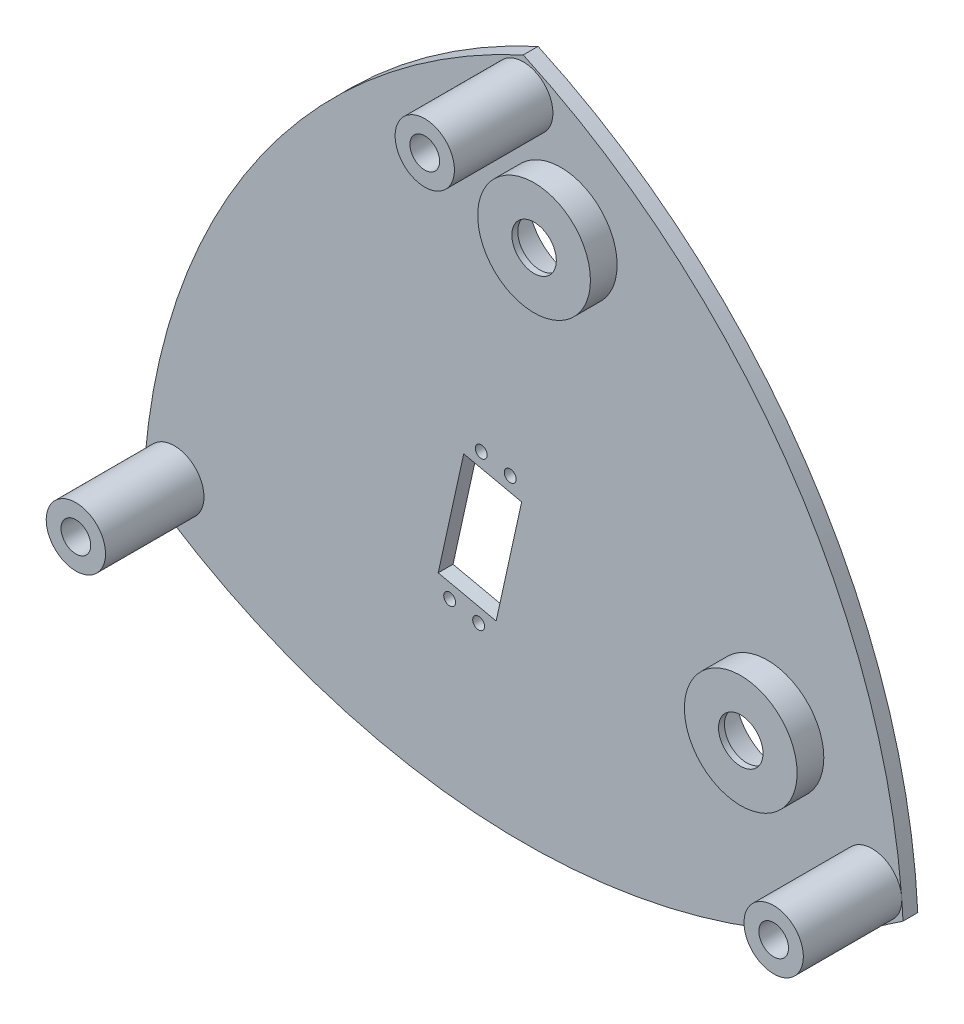
ISO-10303-21;
HEADER;
FILE_DESCRIPTION(('STEP AP214'),'2;1');
FILE_NAME('part.step','',(''),(''),'','','');
FILE_SCHEMA(('AUTOMOTIVE_DESIGN { 1 0 10303 214 1 1 1 1 }'));
ENDSEC;
DATA;
#1=APPLICATION_CONTEXT('core data for automotive mechanical design processes');
#2=APPLICATION_PROTOCOL_DEFINITION('international standard','automotive_design',2000,#1);
#3=PRODUCT_CONTEXT('',#1,'mechanical');
#4=PRODUCT('Part','Part','',(#3));
#5=PRODUCT_RELATED_PRODUCT_CATEGORY('part','',(#4));
#6=PRODUCT_DEFINITION_FORMATION('','',#4);
#7=PRODUCT_DEFINITION_CONTEXT('part definition',#1,'design');
#8=PRODUCT_DEFINITION('design','',#6,#7);
#9=PRODUCT_DEFINITION_SHAPE('','',#8);
#10=(LENGTH_UNIT() NAMED_UNIT(*) SI_UNIT(.MILLI.,.METRE.));
#11=(NAMED_UNIT(*) PLANE_ANGLE_UNIT() SI_UNIT($,.RADIAN.));
#12=(NAMED_UNIT(*) SI_UNIT($,.STERADIAN.) SOLID_ANGLE_UNIT());
#13=UNCERTAINTY_MEASURE_WITH_UNIT(LENGTH_MEASURE(1.E-05),#10,'distance_accuracy_value','');
#14=(GEOMETRIC_REPRESENTATION_CONTEXT(3) GLOBAL_UNCERTAINTY_ASSIGNED_CONTEXT((#13)) GLOBAL_UNIT_ASSIGNED_CONTEXT((#10,
#11,#12)) REPRESENTATION_CONTEXT('',''));
#15=CARTESIAN_POINT('',(0.,0.,0.));
#16=DIRECTION('',(0.,0.,1.));
#17=DIRECTION('',(1.,0.,0.));
#18=AXIS2_PLACEMENT_3D('',#15,#16,#17);
#19=CARTESIAN_POINT('',(-45.8494592180799,10.0108651432086,5.));
#20=DIRECTION('',(0.,0.,1.));
#21=DIRECTION('',(1.,0.,0.));
#22=AXIS2_PLACEMENT_3D('',#19,#20,#21);
#23=PLANE('',#22);
#24=CARTESIAN_POINT('',(-24.807535233517,-56.2577365393747,5.));
#25=DIRECTION('',(0.,0.,1.));
#26=DIRECTION('',(1.,0.,0.));
#27=AXIS2_PLACEMENT_3D('',#24,#25,#26);
#28=CIRCLE('',#27,2.00000000000001);
#29=CARTESIAN_POINT('',(-22.807535233517,-56.2577365393747,5.));
#30=VERTEX_POINT('',#29);
#31=EDGE_CURVE('E250',#30,#30,#28,.T.);
#32=ORIENTED_EDGE('',*,*,#31,.F.);
#33=EDGE_LOOP('',(#32));
#34=FACE_BOUND('',#33,.T.);
#35=CARTESIAN_POINT('',(-15.041579962368,-58.4085776869067,5.));
#36=DIRECTION('',(0.,0.,1.));
#37=DIRECTION('',(1.,0.,0.));
#38=AXIS2_PLACEMENT_3D('',#35,#36,#37);
#39=CIRCLE('',#38,2.);
#40=CARTESIAN_POINT('',(-13.041579962368,-58.4085776869067,5.));
#41=VERTEX_POINT('',#40);
#42=EDGE_CURVE('E266',#41,#41,#39,.T.);
#43=ORIENTED_EDGE('',*,*,#42,.F.);
#44=EDGE_LOOP('',(#43));
#45=FACE_BOUND('',#44,.T.);
#46=CARTESIAN_POINT('',(-14.1608715532334,-7.91625794718709,5.));
#47=DIRECTION('',(0.,0.,1.));
#48=DIRECTION('',(1.,0.,0.));
#49=AXIS2_PLACEMENT_3D('',#46,#47,#48);
#50=CIRCLE('',#49,2.);
#51=CARTESIAN_POINT('',(-12.1608715532334,-7.91625794718709,5.));
#52=VERTEX_POINT('',#51);
#53=EDGE_CURVE('E263',#52,#52,#50,.T.);
#54=ORIENTED_EDGE('',*,*,#53,.F.);
#55=EDGE_LOOP('',(#54));
#56=FACE_BOUND('',#55,.T.);
#57=CARTESIAN_POINT('',(-4.39491628208443,-10.0670990947191,5.));
#58=DIRECTION('',(0.,0.,1.));
#59=DIRECTION('',(1.,0.,0.));
#60=AXIS2_PLACEMENT_3D('',#57,#58,#59);
#61=CIRCLE('',#60,2.);
#62=CARTESIAN_POINT('',(-2.39491628208443,-10.0670990947191,5.));
#63=VERTEX_POINT('',#62);
#64=EDGE_CURVE('E260',#63,#63,#61,.T.);
#65=ORIENTED_EDGE('',*,*,#64,.F.);
#66=EDGE_LOOP('',(#65));
#67=FACE_BOUND('',#66,.T.);
#68=DIRECTION('',(-0.976595527114901,0.215084114753204,0.));
#69=VECTOR('',#68,1.);
#70=CARTESIAN_POINT('',(-49.1707529300035,-5.06956321395371,5.));
#71=LINE('',#70,#69);
#72=CARTESIAN_POINT('',(-0.53358819158764,-15.7813484222809,5.));
#73=VERTEX_POINT('',#72);
#74=CARTESIAN_POINT('',(-20.0654987338857,-11.4796661272169,5.));
#75=VERTEX_POINT('',#74);
#76=EDGE_CURVE('E141',#73,#75,#71,.T.);
#77=ORIENTED_EDGE('',*,*,#76,.F.);
#78=DIRECTION('',(0.215084114753204,0.976595527114901,0.));
#79=VECTOR('',#78,1.);
#80=CARTESIAN_POINT('',(2.78770552033589,-0.700920065118668,5.));
#81=LINE('',#80,#79);
#82=CARTESIAN_POINT('',(-9.13695278171582,-54.845169506877,5.));
#83=VERTEX_POINT('',#82);
#84=EDGE_CURVE('E134',#83,#73,#81,.T.);
#85=ORIENTED_EDGE('',*,*,#84,.F.);
#86=DIRECTION('',(0.976595527114901,-0.215084114753204,0.));
#87=VECTOR('',#86,1.);
#88=CARTESIAN_POINT('',(-57.7741175201316,-44.1333842985497,5.));
#89=LINE('',#88,#87);
#90=CARTESIAN_POINT('',(-28.6688633240138,-50.5434872118129,5.));
#91=VERTEX_POINT('',#90);
#92=EDGE_CURVE('E114',#91,#83,#89,.T.);
#93=ORIENTED_EDGE('',*,*,#92,.F.);
#94=DIRECTION('',(-0.215084114753204,-0.976595527114901,0.));
#95=VECTOR('',#94,1.);
#96=CARTESIAN_POINT('',(-16.7442050219621,3.60076222994541,5.));
#97=LINE('',#96,#95);
#98=EDGE_CURVE('E139',#75,#91,#97,.T.);
#99=ORIENTED_EDGE('',*,*,#98,.F.);
#100=EDGE_LOOP('',(#77,#85,#93,#99));
#101=FACE_BOUND('',#100,.T.);
#102=CARTESIAN_POINT('',(82.3341256154464,-39.5307187827287,5.));
#103=DIRECTION('',(0.,0.,1.));
#104=DIRECTION('',(1.,0.,0.));
#105=AXIS2_PLACEMENT_3D('',#102,#103,#104);
#106=CIRCLE('',#105,19.);
#107=CARTESIAN_POINT('',(101.334125615446,-39.5307187827287,5.));
#108=VERTEX_POINT('',#107);
#109=EDGE_CURVE('E168',#108,#108,#106,.T.);
#110=ORIENTED_EDGE('',*,*,#109,.F.);
#111=EDGE_LOOP('',(#110));
#112=FACE_BOUND('',#111,.T.);
#113=CARTESIAN_POINT('',(0.,103.,5.));
#114=DIRECTION('',(0.,0.,1.));
#115=DIRECTION('',(1.,0.,0.));
#116=AXIS2_PLACEMENT_3D('',#113,#114,#115);
#117=CIRCLE('',#116,10.);
#118=CARTESIAN_POINT('',(-10.,103.,5.));
#119=VERTEX_POINT('',#118);
#120=EDGE_CURVE('E208',#119,#119,#117,.T.);
#121=ORIENTED_EDGE('',*,*,#120,.F.);
#122=EDGE_LOOP('',(#121));
#123=FACE_BOUND('',#122,.T.);
#124=CARTESIAN_POINT('',(-91.6989184361599,-84.9782697135829,5.));
#125=DIRECTION('',(0.,0.,1.));
#126=DIRECTION('',(1.,0.,0.));
#127=AXIS2_PLACEMENT_3D('',#124,#125,#126);
#128=CIRCLE('',#127,220.);
#129=CARTESIAN_POINT('',(128.022678921713,-73.9139281378286,5.));
#130=VERTEX_POINT('',#129);
#131=CARTESIAN_POINT('',(127.62978060665,-67.804983010433,5.));
#132=VERTEX_POINT('',#131);
#133=EDGE_CURVE('E229',#130,#132,#128,.T.);
#134=ORIENTED_EDGE('',*,*,#133,.T.);
#135=CARTESIAN_POINT('',(117.630374076299,-67.9139281378286,5.));
#136=DIRECTION('',(0.,0.,1.));
#137=DIRECTION('',(1.,0.,0.));
#138=AXIS2_PLACEMENT_3D('',#135,#136,#137);
#139=CIRCLE('',#138,9.99999999999999);
#140=CARTESIAN_POINT('',(127.515403429057,-66.4019113736612,5.));
#141=VERTEX_POINT('',#140);
#142=EDGE_CURVE('E182',#141,#132,#139,.T.);
#143=ORIENTED_EDGE('',*,*,#142,.F.);
#144=CARTESIAN_POINT('',(0.,115.,5.));
#145=VERTEX_POINT('',#144);
#146=EDGE_CURVE('E227',#141,#145,#128,.T.);
#147=ORIENTED_EDGE('',*,*,#146,.T.);
#148=CARTESIAN_POINT('',(91.6989184361599,-84.9782697135829,5.));
#149=DIRECTION('',(0.,0.,1.));
#150=DIRECTION('',(-1.,0.,0.));
#151=AXIS2_PLACEMENT_3D('',#148,#149,#150);
#152=CIRCLE('',#151,220.);
#153=CARTESIAN_POINT('',(-127.515403429057,-66.4019113736612,5.));
#154=VERTEX_POINT('',#153);
#155=EDGE_CURVE('E233',#145,#154,#152,.T.);
#156=ORIENTED_EDGE('',*,*,#155,.T.);
#157=CARTESIAN_POINT('',(-117.630374076299,-67.9139281378286,5.));
#158=DIRECTION('',(0.,0.,1.));
#159=DIRECTION('',(1.,0.,0.));
#160=AXIS2_PLACEMENT_3D('',#157,#158,#159);
#161=CIRCLE('',#160,9.99999999999999);
#162=CARTESIAN_POINT('',(-127.62978060665,-67.804983010433,5.));
#163=VERTEX_POINT('',#162);
#164=EDGE_CURVE('E195',#163,#154,#161,.T.);
#165=ORIENTED_EDGE('',*,*,#164,.F.);
#166=CARTESIAN_POINT('',(-128.022678921713,-73.9139281378286,5.));
#167=VERTEX_POINT('',#166);
#168=EDGE_CURVE('E232',#163,#167,#152,.T.);
#169=ORIENTED_EDGE('',*,*,#168,.T.);
#170=CARTESIAN_POINT('',(0.,105.,5.));
#171=DIRECTION('',(0.,0.,1.));
#172=DIRECTION('',(1.,0.,0.));
#173=AXIS2_PLACEMENT_3D('',#170,#171,#172);
#174=CIRCLE('',#173,220.);
#175=EDGE_CURVE('E224',#167,#130,#174,.T.);
#176=ORIENTED_EDGE('',*,*,#175,.T.);
#177=EDGE_LOOP('',(#134,#143,#147,#156,#165,#169,#176));
#178=FACE_BOUND('',#177,.T.);
#179=CARTESIAN_POINT('',(12.6509950664097,69.5155367413891,5.));
#180=DIRECTION('',(0.,0.,1.));
#181=DIRECTION('',(1.,0.,0.));
#182=AXIS2_PLACEMENT_3D('',#179,#180,#181);
#183=CIRCLE('',#182,19.);
#184=CARTESIAN_POINT('',(31.6509950664097,69.5155367413891,5.));
#185=VERTEX_POINT('',#184);
#186=EDGE_CURVE('E165',#185,#185,#183,.T.);
#187=ORIENTED_EDGE('',*,*,#186,.F.);
#188=EDGE_LOOP('',(#187));
#189=FACE_BOUND('',#188,.T.);
#190=ADVANCED_FACE('F35',(#34,#45,#56,#67,#101,#112,#123,#178,#189),#23,.T.);
#191=CARTESIAN_POINT('',(-45.8494592180799,10.0108651432086,0.));
#192=DIRECTION('',(0.,0.,1.));
#193=DIRECTION('',(1.,0.,0.));
#194=AXIS2_PLACEMENT_3D('',#191,#192,#193);
#195=PLANE('',#194);
#196=CARTESIAN_POINT('',(-24.807535233517,-56.2577365393747,0.));
#197=DIRECTION('',(0.,0.,1.));
#198=DIRECTION('',(1.,0.,0.));
#199=AXIS2_PLACEMENT_3D('',#196,#197,#198);
#200=CIRCLE('',#199,2.00000000000001);
#201=CARTESIAN_POINT('',(-22.807535233517,-56.2577365393747,0.));
#202=VERTEX_POINT('',#201);
#203=EDGE_CURVE('E39',#202,#202,#200,.T.);
#204=ORIENTED_EDGE('',*,*,#203,.T.);
#205=EDGE_LOOP('',(#204));
#206=FACE_BOUND('',#205,.T.);
#207=CARTESIAN_POINT('',(-15.041579962368,-58.4085776869067,0.));
#208=DIRECTION('',(0.,0.,1.));
#209=DIRECTION('',(1.,0.,0.));
#210=AXIS2_PLACEMENT_3D('',#207,#208,#209);
#211=CIRCLE('',#210,2.);
#212=CARTESIAN_POINT('',(-13.041579962368,-58.4085776869067,0.));
#213=VERTEX_POINT('',#212);
#214=EDGE_CURVE('E252',#213,#213,#211,.T.);
#215=ORIENTED_EDGE('',*,*,#214,.T.);
#216=EDGE_LOOP('',(#215));
#217=FACE_BOUND('',#216,.T.);
#218=CARTESIAN_POINT('',(-14.1608715532334,-7.91625794718709,0.));
#219=DIRECTION('',(0.,0.,1.));
#220=DIRECTION('',(1.,0.,0.));
#221=AXIS2_PLACEMENT_3D('',#218,#219,#220);
#222=CIRCLE('',#221,2.);
#223=CARTESIAN_POINT('',(-12.1608715532334,-7.91625794718709,0.));
#224=VERTEX_POINT('',#223);
#225=EDGE_CURVE('E249',#224,#224,#222,.T.);
#226=ORIENTED_EDGE('',*,*,#225,.T.);
#227=EDGE_LOOP('',(#226));
#228=FACE_BOUND('',#227,.T.);
#229=CARTESIAN_POINT('',(-4.39491628208443,-10.0670990947191,0.));
#230=DIRECTION('',(0.,0.,1.));
#231=DIRECTION('',(1.,0.,0.));
#232=AXIS2_PLACEMENT_3D('',#229,#230,#231);
#233=CIRCLE('',#232,2.);
#234=CARTESIAN_POINT('',(-2.39491628208443,-10.0670990947191,0.));
#235=VERTEX_POINT('',#234);
#236=EDGE_CURVE('E246',#235,#235,#233,.T.);
#237=ORIENTED_EDGE('',*,*,#236,.T.);
#238=EDGE_LOOP('',(#237));
#239=FACE_BOUND('',#238,.T.);
#240=DIRECTION('',(-0.215084114753204,-0.976595527114901,0.));
#241=VECTOR('',#240,1.);
#242=CARTESIAN_POINT('',(-9.13695278171581,-54.845169506877,0.));
#243=LINE('',#242,#241);
#244=CARTESIAN_POINT('',(-0.533588191587647,-15.7813484222809,0.));
#245=VERTEX_POINT('',#244);
#246=CARTESIAN_POINT('',(-9.13695278171581,-54.845169506877,0.));
#247=VERTEX_POINT('',#246);
#248=EDGE_CURVE('E120',#245,#247,#243,.T.);
#249=ORIENTED_EDGE('',*,*,#248,.F.);
#250=DIRECTION('',(0.976595527114901,-0.215084114753204,0.));
#251=VECTOR('',#250,1.);
#252=CARTESIAN_POINT('',(-0.53358819158764,-15.7813484222809,0.));
#253=LINE('',#252,#251);
#254=CARTESIAN_POINT('',(-20.0654987338857,-11.4796661272169,0.));
#255=VERTEX_POINT('',#254);
#256=EDGE_CURVE('E60',#255,#245,#253,.T.);
#257=ORIENTED_EDGE('',*,*,#256,.F.);
#258=DIRECTION('',(0.215084114753204,0.976595527114901,0.));
#259=VECTOR('',#258,1.);
#260=CARTESIAN_POINT('',(-20.0654987338857,-11.4796661272169,0.));
#261=LINE('',#260,#259);
#262=CARTESIAN_POINT('',(-28.6688633240138,-50.5434872118129,0.));
#263=VERTEX_POINT('',#262);
#264=EDGE_CURVE('E127',#263,#255,#261,.T.);
#265=ORIENTED_EDGE('',*,*,#264,.F.);
#266=DIRECTION('',(-0.976595527114901,0.215084114753204,0.));
#267=VECTOR('',#266,1.);
#268=CARTESIAN_POINT('',(-28.6688633240138,-50.5434872118129,0.));
#269=LINE('',#268,#267);
#270=EDGE_CURVE('E111',#247,#263,#269,.T.);
#271=ORIENTED_EDGE('',*,*,#270,.F.);
#272=EDGE_LOOP('',(#249,#257,#265,#271));
#273=FACE_BOUND('',#272,.T.);
#274=CARTESIAN_POINT('',(12.6509950664097,69.5155367413891,0.));
#275=DIRECTION('',(0.,0.,-1.));
#276=DIRECTION('',(-1.,0.,0.));
#277=AXIS2_PLACEMENT_3D('',#274,#275,#276);
#278=CIRCLE('',#277,16.);
#279=CARTESIAN_POINT('',(-3.34900493359029,69.5155367413891,0.));
#280=VERTEX_POINT('',#279);
#281=EDGE_CURVE('E174',#280,#280,#278,.T.);
#282=ORIENTED_EDGE('',*,*,#281,.F.);
#283=EDGE_LOOP('',(#282));
#284=FACE_BOUND('',#283,.T.);
#285=CARTESIAN_POINT('',(82.3341256154464,-39.5307187827287,0.));
#286=DIRECTION('',(0.,0.,-1.));
#287=DIRECTION('',(-1.,0.,0.));
#288=AXIS2_PLACEMENT_3D('',#285,#286,#287);
#289=CIRCLE('',#288,16.);
#290=CARTESIAN_POINT('',(66.3341256154464,-39.5307187827287,0.));
#291=VERTEX_POINT('',#290);
#292=EDGE_CURVE('E173',#291,#291,#289,.T.);
#293=ORIENTED_EDGE('',*,*,#292,.F.);
#294=EDGE_LOOP('',(#293));
#295=FACE_BOUND('',#294,.T.);
#296=CARTESIAN_POINT('',(0.,105.,0.));
#297=DIRECTION('',(0.,0.,1.));
#298=DIRECTION('',(1.,0.,0.));
#299=AXIS2_PLACEMENT_3D('',#296,#297,#298);
#300=CIRCLE('',#299,220.);
#301=CARTESIAN_POINT('',(-128.022678921713,-73.9139281378286,0.));
#302=VERTEX_POINT('',#301);
#303=CARTESIAN_POINT('',(128.022678921713,-73.9139281378286,0.));
#304=VERTEX_POINT('',#303);
#305=EDGE_CURVE('E223',#302,#304,#300,.T.);
#306=ORIENTED_EDGE('',*,*,#305,.F.);
#307=CARTESIAN_POINT('',(91.6989184361599,-84.9782697135829,0.));
#308=DIRECTION('',(0.,0.,1.));
#309=DIRECTION('',(-1.,0.,0.));
#310=AXIS2_PLACEMENT_3D('',#307,#308,#309);
#311=CIRCLE('',#310,220.);
#312=CARTESIAN_POINT('',(0.,115.,0.));
#313=VERTEX_POINT('',#312);
#314=EDGE_CURVE('E228',#313,#302,#311,.T.);
#315=ORIENTED_EDGE('',*,*,#314,.F.);
#316=CARTESIAN_POINT('',(-91.6989184361599,-84.9782697135829,0.));
#317=DIRECTION('',(0.,0.,1.));
#318=DIRECTION('',(1.,0.,0.));
#319=AXIS2_PLACEMENT_3D('',#316,#317,#318);
#320=CIRCLE('',#319,220.);
#321=EDGE_CURVE('E239',#304,#313,#320,.T.);
#322=ORIENTED_EDGE('',*,*,#321,.F.);
#323=EDGE_LOOP('',(#306,#315,#322));
#324=FACE_BOUND('',#323,.T.);
#325=CARTESIAN_POINT('',(-117.630374076299,-67.9139281378286,0.));
#326=DIRECTION('',(0.,0.,1.));
#327=DIRECTION('',(1.,0.,0.));
#328=AXIS2_PLACEMENT_3D('',#325,#326,#327);
#329=CIRCLE('',#328,5.00000000000001);
#330=CARTESIAN_POINT('',(-112.630374076299,-67.9139281378286,0.));
#331=VERTEX_POINT('',#330);
#332=EDGE_CURVE('E220',#331,#331,#329,.T.);
#333=ORIENTED_EDGE('',*,*,#332,.T.);
#334=EDGE_LOOP('',(#333));
#335=FACE_BOUND('',#334,.T.);
#336=CARTESIAN_POINT('',(117.630374076299,-67.9139281378286,0.));
#337=DIRECTION('',(0.,0.,1.));
#338=DIRECTION('',(1.,0.,0.));
#339=AXIS2_PLACEMENT_3D('',#336,#337,#338);
#340=CIRCLE('',#339,5.00000000000001);
#341=CARTESIAN_POINT('',(122.630374076299,-67.9139281378286,0.));
#342=VERTEX_POINT('',#341);
#343=EDGE_CURVE('E217',#342,#342,#340,.T.);
#344=ORIENTED_EDGE('',*,*,#343,.T.);
#345=EDGE_LOOP('',(#344));
#346=FACE_BOUND('',#345,.T.);
#347=CARTESIAN_POINT('',(0.,103.,0.));
#348=DIRECTION('',(0.,0.,1.));
#349=DIRECTION('',(1.,0.,0.));
#350=AXIS2_PLACEMENT_3D('',#347,#348,#349);
#351=CIRCLE('',#350,5.);
#352=CARTESIAN_POINT('',(5.,103.,0.));
#353=VERTEX_POINT('',#352);
#354=EDGE_CURVE('E212',#353,#353,#351,.T.);
#355=ORIENTED_EDGE('',*,*,#354,.T.);
#356=EDGE_LOOP('',(#355));
#357=FACE_BOUND('',#356,.T.);
#358=ADVANCED_FACE('F124',(#206,#217,#228,#239,#273,#284,#295,#324,#335,#346,#357),#195,.F.);
#359=CARTESIAN_POINT('',(0.,105.,5.));
#360=DIRECTION('',(0.,0.,-1.));
#361=DIRECTION('',(-1.,0.,0.));
#362=AXIS2_PLACEMENT_3D('',#359,#360,#361);
#363=CYLINDRICAL_SURFACE('',#362,220.);
#364=ORIENTED_EDGE('',*,*,#305,.T.);
#365=DIRECTION('',(0.,0.,-1.));
#366=VECTOR('',#365,1.);
#367=CARTESIAN_POINT('',(128.022678921713,-73.9139281378286,5.));
#368=LINE('',#367,#366);
#369=EDGE_CURVE('E11',#130,#304,#368,.T.);
#370=ORIENTED_EDGE('',*,*,#369,.F.);
#371=ORIENTED_EDGE('',*,*,#175,.F.);
#372=DIRECTION('',(0.,0.,-1.));
#373=VECTOR('',#372,1.);
#374=CARTESIAN_POINT('',(-128.022678921713,-73.9139281378286,5.));
#375=LINE('',#374,#373);
#376=EDGE_CURVE('E236',#167,#302,#375,.T.);
#377=ORIENTED_EDGE('',*,*,#376,.T.);
#378=EDGE_LOOP('',(#364,#370,#371,#377));
#379=FACE_BOUND('',#378,.T.);
#380=ADVANCED_FACE('F37',(#379),#363,.T.);
#381=CARTESIAN_POINT('',(-91.6989184361599,-84.9782697135829,5.));
#382=DIRECTION('',(0.,0.,-1.));
#383=DIRECTION('',(-1.,0.,0.));
#384=AXIS2_PLACEMENT_3D('',#381,#382,#383);
#385=CYLINDRICAL_SURFACE('',#384,220.);
#386=ORIENTED_EDGE('',*,*,#321,.T.);
#387=DIRECTION('',(0.,0.,-1.));
#388=VECTOR('',#387,1.);
#389=CARTESIAN_POINT('',(0.,115.,5.));
#390=LINE('',#389,#388);
#391=EDGE_CURVE('E44',#145,#313,#390,.T.);
#392=ORIENTED_EDGE('',*,*,#391,.F.);
#393=ORIENTED_EDGE('',*,*,#146,.F.);
#394=CARTESIAN_POINT('',(-91.6989184361599,-84.9782697135829,5.));
#395=DIRECTION('',(0.,0.,1.));
#396=DIRECTION('',(1.,0.,0.));
#397=AXIS2_PLACEMENT_3D('',#394,#395,#396);
#398=CIRCLE('',#397,220.);
#399=EDGE_CURVE('E186',#132,#141,#398,.T.);
#400=ORIENTED_EDGE('',*,*,#399,.F.);
#401=ORIENTED_EDGE('',*,*,#133,.F.);
#402=ORIENTED_EDGE('',*,*,#369,.T.);
#403=EDGE_LOOP('',(#386,#392,#393,#400,#401,#402));
#404=FACE_BOUND('',#403,.T.);
#405=ADVANCED_FACE('F384',(#404),#385,.T.);
#406=CARTESIAN_POINT('',(91.6989184361599,-84.9782697135829,5.));
#407=DIRECTION('',(0.,0.,-1.));
#408=DIRECTION('',(-1.,0.,0.));
#409=AXIS2_PLACEMENT_3D('',#406,#407,#408);
#410=CYLINDRICAL_SURFACE('',#409,220.);
#411=ORIENTED_EDGE('',*,*,#314,.T.);
#412=ORIENTED_EDGE('',*,*,#376,.F.);
#413=ORIENTED_EDGE('',*,*,#168,.F.);
#414=CARTESIAN_POINT('',(91.6989184361599,-84.9782697135829,5.));
#415=DIRECTION('',(0.,0.,1.));
#416=DIRECTION('',(1.,0.,0.));
#417=AXIS2_PLACEMENT_3D('',#414,#415,#416);
#418=CIRCLE('',#417,220.);
#419=EDGE_CURVE('E199',#154,#163,#418,.T.);
#420=ORIENTED_EDGE('',*,*,#419,.F.);
#421=ORIENTED_EDGE('',*,*,#155,.F.);
#422=ORIENTED_EDGE('',*,*,#391,.T.);
#423=EDGE_LOOP('',(#411,#412,#413,#420,#421,#422));
#424=FACE_BOUND('',#423,.T.);
#425=ADVANCED_FACE('F378',(#424),#410,.T.);
#426=CARTESIAN_POINT('',(-117.630374076299,-67.9139281378286,5.));
#427=DIRECTION('',(0.,0.,-1.));
#428=DIRECTION('',(-1.,0.,0.));
#429=AXIS2_PLACEMENT_3D('',#426,#427,#428);
#430=CYLINDRICAL_SURFACE('',#429,5.00000000000001);
#431=ORIENTED_EDGE('',*,*,#332,.F.);
#432=EDGE_LOOP('',(#431));
#433=FACE_BOUND('',#432,.T.);
#434=CARTESIAN_POINT('',(-117.630374076299,-67.9139281378286,38.2));
#435=DIRECTION('',(0.,0.,1.));
#436=DIRECTION('',(1.,0.,0.));
#437=AXIS2_PLACEMENT_3D('',#434,#435,#436);
#438=CIRCLE('',#437,5.00000000000001);
#439=CARTESIAN_POINT('',(-112.630374076299,-67.9139281378286,38.2));
#440=VERTEX_POINT('',#439);
#441=EDGE_CURVE('E192',#440,#440,#438,.T.);
#442=ORIENTED_EDGE('',*,*,#441,.T.);
#443=EDGE_LOOP('',(#442));
#444=FACE_BOUND('',#443,.T.);
#445=ADVANCED_FACE('F375',(#433,#444),#430,.F.);
#446=CARTESIAN_POINT('',(117.630374076299,-67.9139281378286,5.));
#447=DIRECTION('',(0.,0.,-1.));
#448=DIRECTION('',(-1.,0.,0.));
#449=AXIS2_PLACEMENT_3D('',#446,#447,#448);
#450=CYLINDRICAL_SURFACE('',#449,5.00000000000001);
#451=ORIENTED_EDGE('',*,*,#343,.F.);
#452=EDGE_LOOP('',(#451));
#453=FACE_BOUND('',#452,.T.);
#454=CARTESIAN_POINT('',(117.630374076299,-67.9139281378286,38.2));
#455=DIRECTION('',(0.,0.,1.));
#456=DIRECTION('',(1.,0.,0.));
#457=AXIS2_PLACEMENT_3D('',#454,#455,#456);
#458=CIRCLE('',#457,5.00000000000001);
#459=CARTESIAN_POINT('',(122.630374076299,-67.9139281378286,38.2));
#460=VERTEX_POINT('',#459);
#461=EDGE_CURVE('E177',#460,#460,#458,.T.);
#462=ORIENTED_EDGE('',*,*,#461,.T.);
#463=EDGE_LOOP('',(#462));
#464=FACE_BOUND('',#463,.T.);
#465=ADVANCED_FACE('F371',(#453,#464),#450,.F.);
#466=CARTESIAN_POINT('',(0.,103.,5.));
#467=DIRECTION('',(0.,0.,-1.));
#468=DIRECTION('',(-1.,0.,0.));
#469=AXIS2_PLACEMENT_3D('',#466,#467,#468);
#470=CYLINDRICAL_SURFACE('',#469,5.);
#471=ORIENTED_EDGE('',*,*,#354,.F.);
#472=EDGE_LOOP('',(#471));
#473=FACE_BOUND('',#472,.T.);
#474=CARTESIAN_POINT('',(0.,103.,38.2));
#475=DIRECTION('',(0.,0.,1.));
#476=DIRECTION('',(1.,0.,0.));
#477=AXIS2_PLACEMENT_3D('',#474,#475,#476);
#478=CIRCLE('',#477,5.);
#479=CARTESIAN_POINT('',(5.,103.,38.2));
#480=VERTEX_POINT('',#479);
#481=EDGE_CURVE('E205',#480,#480,#478,.T.);
#482=ORIENTED_EDGE('',*,*,#481,.T.);
#483=EDGE_LOOP('',(#482));
#484=FACE_BOUND('',#483,.T.);
#485=ADVANCED_FACE('F364',(#473,#484),#470,.F.);
#486=CARTESIAN_POINT('',(0.,103.,38.2));
#487=DIRECTION('',(0.,0.,1.));
#488=DIRECTION('',(1.,0.,0.));
#489=AXIS2_PLACEMENT_3D('',#486,#487,#488);
#490=PLANE('',#489);
#491=CARTESIAN_POINT('',(0.,103.,38.2));
#492=DIRECTION('',(0.,0.,1.));
#493=DIRECTION('',(1.,0.,0.));
#494=AXIS2_PLACEMENT_3D('',#491,#492,#493);
#495=CIRCLE('',#494,10.);
#496=CARTESIAN_POINT('',(-10.,103.,38.2));
#497=VERTEX_POINT('',#496);
#498=EDGE_CURVE('E209',#497,#497,#495,.T.);
#499=ORIENTED_EDGE('',*,*,#498,.T.);
#500=EDGE_LOOP('',(#499));
#501=FACE_BOUND('',#500,.T.);
#502=ORIENTED_EDGE('',*,*,#481,.F.);
#503=EDGE_LOOP('',(#502));
#504=FACE_BOUND('',#503,.T.);
#505=ADVANCED_FACE('F361',(#501,#504),#490,.T.);
#506=CARTESIAN_POINT('',(0.,103.,38.2));
#507=DIRECTION('',(0.,0.,-1.));
#508=DIRECTION('',(-1.,0.,0.));
#509=AXIS2_PLACEMENT_3D('',#506,#507,#508);
#510=CYLINDRICAL_SURFACE('',#509,10.);
#511=CARTESIAN_POINT('',(-10.,103.,38.2));
#512=CARTESIAN_POINT('',(-10.,103.,37.8541666666667));
#513=CARTESIAN_POINT('',(-10.,103.,37.5083333333333));
#514=CARTESIAN_POINT('',(-10.,103.,36.8166666666667));
#515=CARTESIAN_POINT('',(-10.,103.,36.4708333333333));
#516=CARTESIAN_POINT('',(-10.,103.,35.7791666666667));
#517=CARTESIAN_POINT('',(-10.,103.,35.4333333333333));
#518=CARTESIAN_POINT('',(-10.,103.,34.7416666666667));
#519=CARTESIAN_POINT('',(-10.,103.,34.3958333333333));
#520=CARTESIAN_POINT('',(-10.,103.,33.7041666666667));
#521=CARTESIAN_POINT('',(-10.,103.,33.3583333333333));
#522=CARTESIAN_POINT('',(-10.,103.,32.6666666666667));
#523=CARTESIAN_POINT('',(-10.,103.,32.3208333333333));
#524=CARTESIAN_POINT('',(-10.,103.,31.6291666666667));
#525=CARTESIAN_POINT('',(-10.,103.,31.2833333333333));
#526=CARTESIAN_POINT('',(-10.,103.,30.5916666666667));
#527=CARTESIAN_POINT('',(-10.,103.,30.2458333333333));
#528=CARTESIAN_POINT('',(-10.,103.,29.5541666666667));
#529=CARTESIAN_POINT('',(-10.,103.,29.2083333333333));
#530=CARTESIAN_POINT('',(-10.,103.,28.5166666666667));
#531=CARTESIAN_POINT('',(-10.,103.,28.1708333333333));
#532=CARTESIAN_POINT('',(-10.,103.,27.4791666666667));
#533=CARTESIAN_POINT('',(-10.,103.,27.1333333333333));
#534=CARTESIAN_POINT('',(-10.,103.,26.4416666666667));
#535=CARTESIAN_POINT('',(-10.,103.,26.0958333333333));
#536=CARTESIAN_POINT('',(-10.,103.,25.4041666666667));
#537=CARTESIAN_POINT('',(-10.,103.,25.0583333333333));
#538=CARTESIAN_POINT('',(-10.,103.,24.3666666666667));
#539=CARTESIAN_POINT('',(-10.,103.,24.0208333333333));
#540=CARTESIAN_POINT('',(-10.,103.,23.3291666666667));
#541=CARTESIAN_POINT('',(-10.,103.,22.9833333333333));
#542=CARTESIAN_POINT('',(-10.,103.,22.2916666666667));
#543=CARTESIAN_POINT('',(-10.,103.,21.9458333333333));
#544=CARTESIAN_POINT('',(-10.,103.,21.2541666666667));
#545=CARTESIAN_POINT('',(-10.,103.,20.9083333333333));
#546=CARTESIAN_POINT('',(-10.,103.,20.2166666666667));
#547=CARTESIAN_POINT('',(-10.,103.,19.8708333333333));
#548=CARTESIAN_POINT('',(-10.,103.,19.1791666666667));
#549=CARTESIAN_POINT('',(-10.,103.,18.8333333333333));
#550=CARTESIAN_POINT('',(-10.,103.,18.1416666666667));
#551=CARTESIAN_POINT('',(-10.,103.,17.7958333333333));
#552=CARTESIAN_POINT('',(-10.,103.,17.1041666666667));
#553=CARTESIAN_POINT('',(-10.,103.,16.7583333333333));
#554=CARTESIAN_POINT('',(-10.,103.,16.0666666666667));
#555=CARTESIAN_POINT('',(-10.,103.,15.7208333333333));
#556=CARTESIAN_POINT('',(-10.,103.,15.0291666666667));
#557=CARTESIAN_POINT('',(-10.,103.,14.6833333333333));
#558=CARTESIAN_POINT('',(-10.,103.,13.9916666666667));
#559=CARTESIAN_POINT('',(-10.,103.,13.6458333333333));
#560=CARTESIAN_POINT('',(-10.,103.,12.9541666666667));
#561=CARTESIAN_POINT('',(-10.,103.,12.6083333333333));
#562=CARTESIAN_POINT('',(-10.,103.,11.9166666666667));
#563=CARTESIAN_POINT('',(-10.,103.,11.5708333333333));
#564=CARTESIAN_POINT('',(-10.,103.,10.8791666666667));
#565=CARTESIAN_POINT('',(-10.,103.,10.5333333333333));
#566=CARTESIAN_POINT('',(-10.,103.,9.84166666666667));
#567=CARTESIAN_POINT('',(-10.,103.,9.49583333333333));
#568=CARTESIAN_POINT('',(-10.,103.,8.80416666666667));
#569=CARTESIAN_POINT('',(-10.,103.,8.45833333333333));
#570=CARTESIAN_POINT('',(-10.,103.,7.76666666666666));
#571=CARTESIAN_POINT('',(-10.,103.,7.42083333333333));
#572=CARTESIAN_POINT('',(-10.,103.,6.72916666666666));
#573=CARTESIAN_POINT('',(-10.,103.,6.38333333333333));
#574=CARTESIAN_POINT('',(-10.,103.,5.69166666666666));
#575=CARTESIAN_POINT('',(-10.,103.,5.34583333333333));
#576=CARTESIAN_POINT('',(-10.,103.,5.));
#577=B_SPLINE_CURVE_WITH_KNOTS('',3,(#511,#512,#513,#514,#515,#516,#517,#518,#519,#520,#521,
#522,#523,#524,#525,#526,#527,#528,#529,#530,#531,#532,#533,#534,#535,#536,#537,#538,#539,#540,
#541,#542,#543,#544,#545,#546,#547,#548,#549,#550,#551,#552,#553,#554,#555,#556,#557,#558,#559,
#560,#561,#562,#563,#564,#565,#566,#567,#568,#569,#570,#571,#572,#573,#574,#575,#576),
.UNSPECIFIED.,.F.,.F.,(4,2,2,2,2,2,2,2,2,2,2,2,2,2,2,2,2,2,2,2,2,2,2,2,2,2,2,2,2,2,2,2,4),(0.,
1.0375,2.07499999999999,3.1125,4.14999999999999,5.1875,6.22499999999999,7.26249999999999,8.3,
9.3375,10.375,11.4125,12.45,13.4875,14.525,15.5625,16.6,17.6375,18.675,19.7125,20.75,21.7875,
22.825,23.8625,24.9,25.9375,26.975,28.0125,29.05,30.0875,31.125,32.1625,33.2),.UNSPECIFIED.);
#578=EDGE_CURVE('BSEAM356',#497,#119,#577,.T.);
#579=ORIENTED_EDGE('',*,*,#498,.F.);
#580=ORIENTED_EDGE('',*,*,#120,.T.);
#581=ORIENTED_EDGE('',*,*,#578,.T.);
#582=ORIENTED_EDGE('',*,*,#578,.F.);
#583=EDGE_LOOP('',(#579,#581,#580,#582));
#584=FACE_BOUND('',#583,.T.);
#585=ADVANCED_FACE('F356',(#584),#510,.T.);
#586=CARTESIAN_POINT('',(-117.630374076299,-67.9139281378286,5.));
#587=DIRECTION('',(0.,0.,1.));
#588=DIRECTION('',(1.,0.,0.));
#589=AXIS2_PLACEMENT_3D('',#586,#587,#588);
#590=PLANE('',#589);
#591=EDGE_CURVE('E200',#154,#163,#161,.T.);
#592=ORIENTED_EDGE('',*,*,#591,.F.);
#593=ORIENTED_EDGE('',*,*,#419,.T.);
#594=EDGE_LOOP('',(#592,#593));
#595=FACE_BOUND('',#594,.T.);
#596=ADVANCED_FACE('F352',(#595),#590,.F.);
#597=CARTESIAN_POINT('',(-117.630374076299,-67.9139281378286,38.2));
#598=DIRECTION('',(0.,0.,1.));
#599=DIRECTION('',(1.,0.,0.));
#600=AXIS2_PLACEMENT_3D('',#597,#598,#599);
#601=PLANE('',#600);
#602=CARTESIAN_POINT('',(-117.630374076299,-67.9139281378286,38.2));
#603=DIRECTION('',(0.,0.,1.));
#604=DIRECTION('',(1.,0.,0.));
#605=AXIS2_PLACEMENT_3D('',#602,#603,#604);
#606=CIRCLE('',#605,9.99999999999999);
#607=CARTESIAN_POINT('',(-107.630374076299,-67.9139281378286,38.2));
#608=VERTEX_POINT('',#607);
#609=EDGE_CURVE('E196',#608,#608,#606,.T.);
#610=ORIENTED_EDGE('',*,*,#609,.T.);
#611=EDGE_LOOP('',(#610));
#612=FACE_BOUND('',#611,.T.);
#613=ORIENTED_EDGE('',*,*,#441,.F.);
#614=EDGE_LOOP('',(#613));
#615=FACE_BOUND('',#614,.T.);
#616=ADVANCED_FACE('F349',(#612,#615),#601,.T.);
#617=CARTESIAN_POINT('',(-117.630374076299,-67.9139281378286,38.2));
#618=DIRECTION('',(0.,0.,-1.));
#619=DIRECTION('',(-1.,0.,0.));
#620=AXIS2_PLACEMENT_3D('',#617,#618,#619);
#621=CYLINDRICAL_SURFACE('',#620,9.99999999999999);
#622=ORIENTED_EDGE('',*,*,#609,.F.);
#623=EDGE_LOOP('',(#622));
#624=FACE_BOUND('',#623,.T.);
#625=ORIENTED_EDGE('',*,*,#591,.T.);
#626=ORIENTED_EDGE('',*,*,#164,.T.);
#627=EDGE_LOOP('',(#625,#626));
#628=FACE_BOUND('',#627,.T.);
#629=ADVANCED_FACE('F344',(#624,#628),#621,.T.);
#630=CARTESIAN_POINT('',(117.630374076299,-67.9139281378286,5.));
#631=DIRECTION('',(0.,0.,1.));
#632=DIRECTION('',(1.,0.,0.));
#633=AXIS2_PLACEMENT_3D('',#630,#631,#632);
#634=PLANE('',#633);
#635=EDGE_CURVE('E187',#132,#141,#139,.T.);
#636=ORIENTED_EDGE('',*,*,#635,.F.);
#637=ORIENTED_EDGE('',*,*,#399,.T.);
#638=EDGE_LOOP('',(#636,#637));
#639=FACE_BOUND('',#638,.T.);
#640=ADVANCED_FACE('F340',(#639),#634,.F.);
#641=CARTESIAN_POINT('',(117.630374076299,-67.9139281378286,38.2));
#642=DIRECTION('',(0.,0.,1.));
#643=DIRECTION('',(1.,0.,0.));
#644=AXIS2_PLACEMENT_3D('',#641,#642,#643);
#645=PLANE('',#644);
#646=CARTESIAN_POINT('',(117.630374076299,-67.9139281378286,38.2));
#647=DIRECTION('',(0.,0.,1.));
#648=DIRECTION('',(1.,0.,0.));
#649=AXIS2_PLACEMENT_3D('',#646,#647,#648);
#650=CIRCLE('',#649,9.99999999999999);
#651=CARTESIAN_POINT('',(127.630374076299,-67.9139281378286,38.2));
#652=VERTEX_POINT('',#651);
#653=EDGE_CURVE('E183',#652,#652,#650,.T.);
#654=ORIENTED_EDGE('',*,*,#653,.T.);
#655=EDGE_LOOP('',(#654));
#656=FACE_BOUND('',#655,.T.);
#657=ORIENTED_EDGE('',*,*,#461,.F.);
#658=EDGE_LOOP('',(#657));
#659=FACE_BOUND('',#658,.T.);
#660=ADVANCED_FACE('F337',(#656,#659),#645,.T.);
#661=CARTESIAN_POINT('',(117.630374076299,-67.9139281378286,38.2));
#662=DIRECTION('',(0.,0.,-1.));
#663=DIRECTION('',(-1.,0.,0.));
#664=AXIS2_PLACEMENT_3D('',#661,#662,#663);
#665=CYLINDRICAL_SURFACE('',#664,9.99999999999999);
#666=ORIENTED_EDGE('',*,*,#653,.F.);
#667=EDGE_LOOP('',(#666));
#668=FACE_BOUND('',#667,.T.);
#669=ORIENTED_EDGE('',*,*,#635,.T.);
#670=ORIENTED_EDGE('',*,*,#142,.T.);
#671=EDGE_LOOP('',(#669,#670));
#672=FACE_BOUND('',#671,.T.);
#673=ADVANCED_FACE('F333',(#668,#672),#665,.T.);
#674=CARTESIAN_POINT('',(82.3341256154464,-39.5307187827287,15.));
#675=DIRECTION('',(0.,0.,-1.));
#676=DIRECTION('',(-1.,0.,0.));
#677=AXIS2_PLACEMENT_3D('',#674,#675,#676);
#678=CYLINDRICAL_SURFACE('',#677,16.);
#679=ORIENTED_EDGE('',*,*,#292,.T.);
#680=EDGE_LOOP('',(#679));
#681=FACE_BOUND('',#680,.T.);
#682=CARTESIAN_POINT('',(82.3341256154464,-39.5307187827287,12.));
#683=DIRECTION('',(0.,0.,1.));
#684=DIRECTION('',(1.,0.,0.));
#685=AXIS2_PLACEMENT_3D('',#682,#683,#684);
#686=CIRCLE('',#685,16.);
#687=CARTESIAN_POINT('',(98.3341256154464,-39.5307187827287,12.));
#688=VERTEX_POINT('',#687);
#689=EDGE_CURVE('E152',#688,#688,#686,.T.);
#690=ORIENTED_EDGE('',*,*,#689,.T.);
#691=EDGE_LOOP('',(#690));
#692=FACE_BOUND('',#691,.T.);
#693=ADVANCED_FACE('F324',(#681,#692),#678,.F.);
#694=CARTESIAN_POINT('',(12.6509950664097,69.5155367413891,15.));
#695=DIRECTION('',(0.,0.,-1.));
#696=DIRECTION('',(-1.,0.,0.));
#697=AXIS2_PLACEMENT_3D('',#694,#695,#696);
#698=CYLINDRICAL_SURFACE('',#697,16.);
#699=ORIENTED_EDGE('',*,*,#281,.T.);
#700=EDGE_LOOP('',(#699));
#701=FACE_BOUND('',#700,.T.);
#702=CARTESIAN_POINT('',(12.6509950664097,69.5155367413891,12.));
#703=DIRECTION('',(0.,0.,1.));
#704=DIRECTION('',(1.,0.,0.));
#705=AXIS2_PLACEMENT_3D('',#702,#703,#704);
#706=CIRCLE('',#705,16.);
#707=CARTESIAN_POINT('',(28.6509950664097,69.5155367413891,12.));
#708=VERTEX_POINT('',#707);
#709=EDGE_CURVE('E162',#708,#708,#706,.T.);
#710=ORIENTED_EDGE('',*,*,#709,.T.);
#711=EDGE_LOOP('',(#710));
#712=FACE_BOUND('',#711,.T.);
#713=ADVANCED_FACE('F322',(#701,#712),#698,.F.);
#714=CARTESIAN_POINT('',(82.3341256154464,-39.5307187827287,12.));
#715=DIRECTION('',(0.,0.,-1.));
#716=DIRECTION('',(-1.,0.,0.));
#717=AXIS2_PLACEMENT_3D('',#714,#715,#716);
#718=CYLINDRICAL_SURFACE('',#717,19.);
#719=ORIENTED_EDGE('',*,*,#109,.T.);
#720=EDGE_LOOP('',(#719));
#721=FACE_BOUND('',#720,.T.);
#722=CARTESIAN_POINT('',(82.3341256154464,-39.5307187827287,14.));
#723=DIRECTION('',(0.,0.,1.));
#724=DIRECTION('',(1.,0.,0.));
#725=AXIS2_PLACEMENT_3D('',#722,#723,#724);
#726=CIRCLE('',#725,19.);
#727=CARTESIAN_POINT('',(101.334125615446,-39.5307187827287,14.));
#728=VERTEX_POINT('',#727);
#729=EDGE_CURVE('E147',#728,#728,#726,.T.);
#730=ORIENTED_EDGE('',*,*,#729,.F.);
#731=EDGE_LOOP('',(#730));
#732=FACE_BOUND('',#731,.T.);
#733=ADVANCED_FACE('F300',(#721,#732),#718,.T.);
#734=CARTESIAN_POINT('',(12.6509950664097,69.5155367413891,12.));
#735=DIRECTION('',(0.,0.,-1.));
#736=DIRECTION('',(-1.,0.,0.));
#737=AXIS2_PLACEMENT_3D('',#734,#735,#736);
#738=CYLINDRICAL_SURFACE('',#737,19.);
#739=ORIENTED_EDGE('',*,*,#186,.T.);
#740=EDGE_LOOP('',(#739));
#741=FACE_BOUND('',#740,.T.);
#742=CARTESIAN_POINT('',(12.6509950664097,69.5155367413891,14.));
#743=DIRECTION('',(0.,0.,1.));
#744=DIRECTION('',(1.,0.,0.));
#745=AXIS2_PLACEMENT_3D('',#742,#743,#744);
#746=CIRCLE('',#745,19.);
#747=CARTESIAN_POINT('',(31.6509950664097,69.5155367413891,14.));
#748=VERTEX_POINT('',#747);
#749=EDGE_CURVE('E156',#748,#748,#746,.T.);
#750=ORIENTED_EDGE('',*,*,#749,.F.);
#751=EDGE_LOOP('',(#750));
#752=FACE_BOUND('',#751,.T.);
#753=ADVANCED_FACE('F296',(#741,#752),#738,.T.);
#754=CARTESIAN_POINT('',(12.6509950664097,69.5155367413891,12.));
#755=DIRECTION('',(0.,0.,1.));
#756=DIRECTION('',(1.,0.,0.));
#757=AXIS2_PLACEMENT_3D('',#754,#755,#756);
#758=PLANE('',#757);
#759=CARTESIAN_POINT('',(12.6509950664097,69.5155367413891,12.));
#760=DIRECTION('',(0.,0.,1.));
#761=DIRECTION('',(1.,0.,0.));
#762=AXIS2_PLACEMENT_3D('',#759,#760,#761);
#763=CIRCLE('',#762,7.5);
#764=CARTESIAN_POINT('',(20.1509950664097,69.5155367413891,12.));
#765=VERTEX_POINT('',#764);
#766=EDGE_CURVE('E157',#765,#765,#763,.T.);
#767=ORIENTED_EDGE('',*,*,#766,.T.);
#768=EDGE_LOOP('',(#767));
#769=FACE_BOUND('',#768,.T.);
#770=ORIENTED_EDGE('',*,*,#709,.F.);
#771=EDGE_LOOP('',(#770));
#772=FACE_BOUND('',#771,.T.);
#773=ADVANCED_FACE('F299',(#769,#772),#758,.F.);
#774=CARTESIAN_POINT('',(12.6509950664097,69.5155367413891,14.));
#775=DIRECTION('',(0.,0.,1.));
#776=DIRECTION('',(1.,0.,0.));
#777=AXIS2_PLACEMENT_3D('',#774,#775,#776);
#778=PLANE('',#777);
#779=ORIENTED_EDGE('',*,*,#749,.T.);
#780=EDGE_LOOP('',(#779));
#781=FACE_BOUND('',#780,.T.);
#782=CARTESIAN_POINT('',(12.6509950664097,69.5155367413891,14.));
#783=DIRECTION('',(0.,0.,1.));
#784=DIRECTION('',(1.,0.,0.));
#785=AXIS2_PLACEMENT_3D('',#782,#783,#784);
#786=CIRCLE('',#785,7.5);
#787=CARTESIAN_POINT('',(20.1509950664097,69.5155367413891,14.));
#788=VERTEX_POINT('',#787);
#789=EDGE_CURVE('E153',#788,#788,#786,.T.);
#790=ORIENTED_EDGE('',*,*,#789,.F.);
#791=EDGE_LOOP('',(#790));
#792=FACE_BOUND('',#791,.T.);
#793=ADVANCED_FACE('F304',(#781,#792),#778,.T.);
#794=CARTESIAN_POINT('',(12.6509950664097,69.5155367413891,14.));
#795=DIRECTION('',(0.,0.,-1.));
#796=DIRECTION('',(-1.,0.,0.));
#797=AXIS2_PLACEMENT_3D('',#794,#795,#796);
#798=CYLINDRICAL_SURFACE('',#797,7.5);
#799=ORIENTED_EDGE('',*,*,#789,.T.);
#800=EDGE_LOOP('',(#799));
#801=FACE_BOUND('',#800,.T.);
#802=ORIENTED_EDGE('',*,*,#766,.F.);
#803=EDGE_LOOP('',(#802));
#804=FACE_BOUND('',#803,.T.);
#805=ADVANCED_FACE('F307',(#801,#804),#798,.F.);
#806=CARTESIAN_POINT('',(82.3341256154464,-39.5307187827287,12.));
#807=DIRECTION('',(0.,0.,1.));
#808=DIRECTION('',(1.,0.,0.));
#809=AXIS2_PLACEMENT_3D('',#806,#807,#808);
#810=PLANE('',#809);
#811=CARTESIAN_POINT('',(82.3341256154464,-39.5307187827287,12.));
#812=DIRECTION('',(0.,0.,1.));
#813=DIRECTION('',(1.,0.,0.));
#814=AXIS2_PLACEMENT_3D('',#811,#812,#813);
#815=CIRCLE('',#814,7.50000000000001);
#816=CARTESIAN_POINT('',(89.8341256154464,-39.5307187827287,12.));
#817=VERTEX_POINT('',#816);
#818=EDGE_CURVE('E143',#817,#817,#815,.T.);
#819=ORIENTED_EDGE('',*,*,#818,.T.);
#820=EDGE_LOOP('',(#819));
#821=FACE_BOUND('',#820,.T.);
#822=ORIENTED_EDGE('',*,*,#689,.F.);
#823=EDGE_LOOP('',(#822));
#824=FACE_BOUND('',#823,.T.);
#825=ADVANCED_FACE('F313',(#821,#824),#810,.F.);
#826=CARTESIAN_POINT('',(82.3341256154464,-39.5307187827287,14.));
#827=DIRECTION('',(0.,0.,1.));
#828=DIRECTION('',(1.,0.,0.));
#829=AXIS2_PLACEMENT_3D('',#826,#827,#828);
#830=PLANE('',#829);
#831=ORIENTED_EDGE('',*,*,#729,.T.);
#832=EDGE_LOOP('',(#831));
#833=FACE_BOUND('',#832,.T.);
#834=CARTESIAN_POINT('',(82.3341256154464,-39.5307187827287,14.));
#835=DIRECTION('',(0.,0.,1.));
#836=DIRECTION('',(1.,0.,0.));
#837=AXIS2_PLACEMENT_3D('',#834,#835,#836);
#838=CIRCLE('',#837,7.50000000000001);
#839=CARTESIAN_POINT('',(89.8341256154464,-39.5307187827287,14.));
#840=VERTEX_POINT('',#839);
#841=EDGE_CURVE('E144',#840,#840,#838,.T.);
#842=ORIENTED_EDGE('',*,*,#841,.F.);
#843=EDGE_LOOP('',(#842));
#844=FACE_BOUND('',#843,.T.);
#845=ADVANCED_FACE('F482',(#833,#844),#830,.T.);
#846=CARTESIAN_POINT('',(82.3341256154464,-39.5307187827287,14.));
#847=DIRECTION('',(0.,0.,-1.));
#848=DIRECTION('',(-1.,0.,0.));
#849=AXIS2_PLACEMENT_3D('',#846,#847,#848);
#850=CYLINDRICAL_SURFACE('',#849,7.50000000000001);
#851=ORIENTED_EDGE('',*,*,#841,.T.);
#852=EDGE_LOOP('',(#851));
#853=FACE_BOUND('',#852,.T.);
#854=ORIENTED_EDGE('',*,*,#818,.F.);
#855=EDGE_LOOP('',(#854));
#856=FACE_BOUND('',#855,.T.);
#857=ADVANCED_FACE('F473',(#853,#856),#850,.F.);
#858=CARTESIAN_POINT('',(-0.53358819158764,-15.7813484222809,10.));
#859=DIRECTION('',(0.215084114753204,0.976595527114901,0.));
#860=DIRECTION('',(-0.976595527114901,0.215084114753204,0.));
#861=AXIS2_PLACEMENT_3D('',#858,#859,#860);
#862=PLANE('',#861);
#863=ORIENTED_EDGE('',*,*,#76,.T.);
#864=DIRECTION('',(0.,0.,-1.));
#865=VECTOR('',#864,1.);
#866=CARTESIAN_POINT('',(-20.0654987338857,-11.4796661272169,10.));
#867=LINE('',#866,#865);
#868=EDGE_CURVE('E132',#75,#255,#867,.T.);
#869=ORIENTED_EDGE('',*,*,#868,.T.);
#870=ORIENTED_EDGE('',*,*,#256,.T.);
#871=DIRECTION('',(0.,0.,-1.));
#872=VECTOR('',#871,1.);
#873=CARTESIAN_POINT('',(-0.53358819158764,-15.7813484222809,10.));
#874=LINE('',#873,#872);
#875=EDGE_CURVE('E117',#73,#245,#874,.T.);
#876=ORIENTED_EDGE('',*,*,#875,.F.);
#877=EDGE_LOOP('',(#863,#869,#870,#876));
#878=FACE_BOUND('',#877,.T.);
#879=ADVANCED_FACE('F463',(#878),#862,.F.);
#880=CARTESIAN_POINT('',(-20.0654987338857,-11.4796661272169,10.));
#881=DIRECTION('',(-0.976595527114901,0.215084114753204,0.));
#882=DIRECTION('',(-0.215084114753204,-0.976595527114901,0.));
#883=AXIS2_PLACEMENT_3D('',#880,#881,#882);
#884=PLANE('',#883);
#885=ORIENTED_EDGE('',*,*,#98,.T.);
#886=DIRECTION('',(0.,0.,-1.));
#887=VECTOR('',#886,1.);
#888=CARTESIAN_POINT('',(-28.6688633240138,-50.5434872118129,10.));
#889=LINE('',#888,#887);
#890=EDGE_CURVE('E116',#91,#263,#889,.T.);
#891=ORIENTED_EDGE('',*,*,#890,.T.);
#892=ORIENTED_EDGE('',*,*,#264,.T.);
#893=ORIENTED_EDGE('',*,*,#868,.F.);
#894=EDGE_LOOP('',(#885,#891,#892,#893));
#895=FACE_BOUND('',#894,.T.);
#896=ADVANCED_FACE('F454',(#895),#884,.F.);
#897=CARTESIAN_POINT('',(-28.6688633240138,-50.5434872118129,10.));
#898=DIRECTION('',(-0.215084114753204,-0.976595527114901,0.));
#899=DIRECTION('',(0.976595527114901,-0.215084114753204,0.));
#900=AXIS2_PLACEMENT_3D('',#897,#898,#899);
#901=PLANE('',#900);
#902=ORIENTED_EDGE('',*,*,#92,.T.);
#903=DIRECTION('',(0.,0.,-1.));
#904=VECTOR('',#903,1.);
#905=CARTESIAN_POINT('',(-9.13695278171581,-54.845169506877,10.));
#906=LINE('',#905,#904);
#907=EDGE_CURVE('E52',#83,#247,#906,.T.);
#908=ORIENTED_EDGE('',*,*,#907,.T.);
#909=ORIENTED_EDGE('',*,*,#270,.T.);
#910=ORIENTED_EDGE('',*,*,#890,.F.);
#911=EDGE_LOOP('',(#902,#908,#909,#910));
#912=FACE_BOUND('',#911,.T.);
#913=ADVANCED_FACE('F108',(#912),#901,.F.);
#914=CARTESIAN_POINT('',(-9.13695278171581,-54.845169506877,10.));
#915=DIRECTION('',(0.976595527114901,-0.215084114753204,0.));
#916=DIRECTION('',(0.215084114753204,0.976595527114901,0.));
#917=AXIS2_PLACEMENT_3D('',#914,#915,#916);
#918=PLANE('',#917);
#919=ORIENTED_EDGE('',*,*,#84,.T.);
#920=ORIENTED_EDGE('',*,*,#875,.T.);
#921=ORIENTED_EDGE('',*,*,#248,.T.);
#922=ORIENTED_EDGE('',*,*,#907,.F.);
#923=EDGE_LOOP('',(#919,#920,#921,#922));
#924=FACE_BOUND('',#923,.T.);
#925=ADVANCED_FACE('F121',(#924),#918,.F.);
#926=CARTESIAN_POINT('',(-4.39491628208443,-10.0670990947191,-5.));
#927=DIRECTION('',(0.,0.,1.));
#928=DIRECTION('',(1.,0.,0.));
#929=AXIS2_PLACEMENT_3D('',#926,#927,#928);
#930=CYLINDRICAL_SURFACE('',#929,2.);
#931=ORIENTED_EDGE('',*,*,#64,.T.);
#932=EDGE_LOOP('',(#931));
#933=FACE_BOUND('',#932,.T.);
#934=ORIENTED_EDGE('',*,*,#236,.F.);
#935=EDGE_LOOP('',(#934));
#936=FACE_BOUND('',#935,.T.);
#937=ADVANCED_FACE('F443',(#933,#936),#930,.F.);
#938=CARTESIAN_POINT('',(-14.1608715532334,-7.91625794718709,-5.));
#939=DIRECTION('',(0.,0.,1.));
#940=DIRECTION('',(1.,0.,0.));
#941=AXIS2_PLACEMENT_3D('',#938,#939,#940);
#942=CYLINDRICAL_SURFACE('',#941,2.);
#943=ORIENTED_EDGE('',*,*,#53,.T.);
#944=EDGE_LOOP('',(#943));
#945=FACE_BOUND('',#944,.T.);
#946=ORIENTED_EDGE('',*,*,#225,.F.);
#947=EDGE_LOOP('',(#946));
#948=FACE_BOUND('',#947,.T.);
#949=ADVANCED_FACE('F647',(#945,#948),#942,.F.);
#950=CARTESIAN_POINT('',(-15.041579962368,-58.4085776869067,-5.));
#951=DIRECTION('',(0.,0.,1.));
#952=DIRECTION('',(1.,0.,0.));
#953=AXIS2_PLACEMENT_3D('',#950,#951,#952);
#954=CYLINDRICAL_SURFACE('',#953,2.);
#955=ORIENTED_EDGE('',*,*,#42,.T.);
#956=EDGE_LOOP('',(#955));
#957=FACE_BOUND('',#956,.T.);
#958=ORIENTED_EDGE('',*,*,#214,.F.);
#959=EDGE_LOOP('',(#958));
#960=FACE_BOUND('',#959,.T.);
#961=ADVANCED_FACE('F651',(#957,#960),#954,.F.);
#962=CARTESIAN_POINT('',(-24.807535233517,-56.2577365393747,-5.));
#963=DIRECTION('',(0.,0.,1.));
#964=DIRECTION('',(1.,0.,0.));
#965=AXIS2_PLACEMENT_3D('',#962,#963,#964);
#966=CYLINDRICAL_SURFACE('',#965,2.00000000000001);
#967=ORIENTED_EDGE('',*,*,#31,.T.);
#968=EDGE_LOOP('',(#967));
#969=FACE_BOUND('',#968,.T.);
#970=ORIENTED_EDGE('',*,*,#203,.F.);
#971=EDGE_LOOP('',(#970));
#972=FACE_BOUND('',#971,.T.);
#973=ADVANCED_FACE('F272',(#969,#972),#966,.F.);
#974=CLOSED_SHELL('',(#190,#358,#380,#405,#425,#445,#465,#485,#505,#585,#596,#616,#629,#640,
#660,#673,#693,#713,#733,#753,#773,#793,#805,#825,#845,#857,#879,#896,#913,#925,#937,#949,#961,#973));
#975=MANIFOLD_SOLID_BREP('B2',#974);
#976=ADVANCED_BREP_SHAPE_REPRESENTATION('',(#18,#975),#14);
#977=SHAPE_DEFINITION_REPRESENTATION(#9,#976);
ENDSEC;
END-ISO-10303-21;
